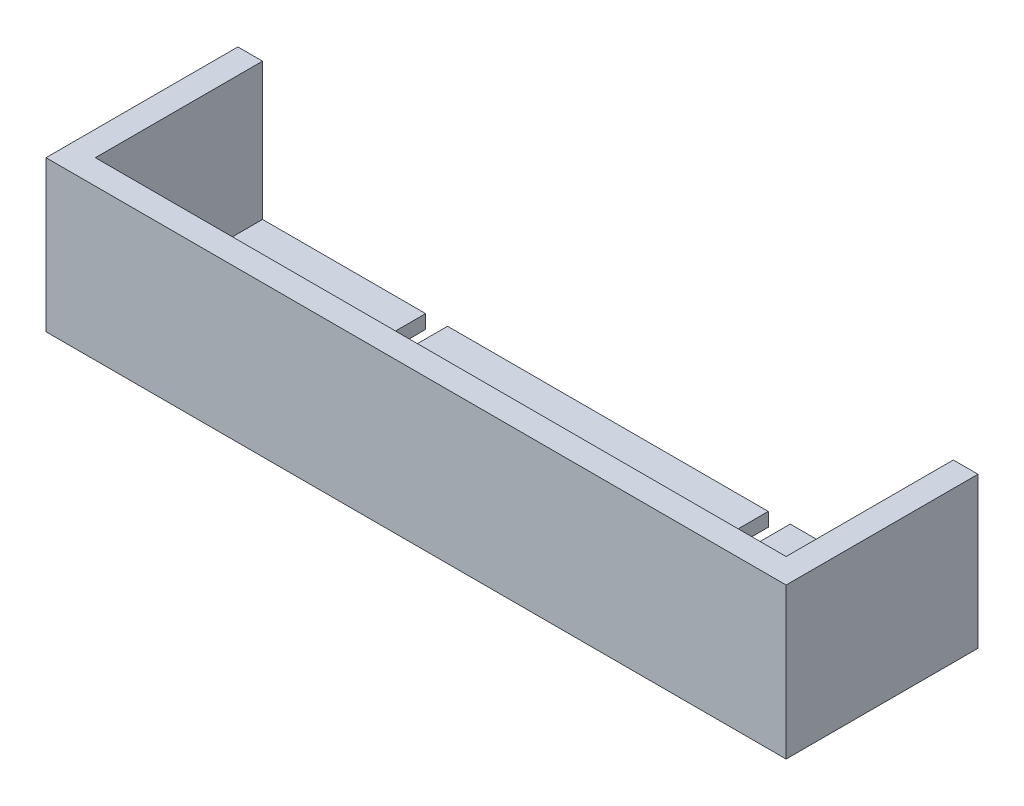
ISO-10303-21;
HEADER;
FILE_DESCRIPTION(('STEP AP214'),'2;1');
FILE_NAME('part.step','',(''),(''),'','','');
FILE_SCHEMA(('AUTOMOTIVE_DESIGN { 1 0 10303 214 1 1 1 1 }'));
ENDSEC;
DATA;
#1=APPLICATION_CONTEXT('core data for automotive mechanical design processes');
#2=APPLICATION_PROTOCOL_DEFINITION('international standard','automotive_design',2000,#1);
#3=PRODUCT_CONTEXT('',#1,'mechanical');
#4=PRODUCT('Part','Part','',(#3));
#5=PRODUCT_RELATED_PRODUCT_CATEGORY('part','',(#4));
#6=PRODUCT_DEFINITION_FORMATION('','',#4);
#7=PRODUCT_DEFINITION_CONTEXT('part definition',#1,'design');
#8=PRODUCT_DEFINITION('design','',#6,#7);
#9=PRODUCT_DEFINITION_SHAPE('','',#8);
#10=(LENGTH_UNIT() NAMED_UNIT(*) SI_UNIT(.MILLI.,.METRE.));
#11=(NAMED_UNIT(*) PLANE_ANGLE_UNIT() SI_UNIT($,.RADIAN.));
#12=(NAMED_UNIT(*) SI_UNIT($,.STERADIAN.) SOLID_ANGLE_UNIT());
#13=UNCERTAINTY_MEASURE_WITH_UNIT(LENGTH_MEASURE(1.E-05),#10,'distance_accuracy_value','');
#14=(GEOMETRIC_REPRESENTATION_CONTEXT(3) GLOBAL_UNCERTAINTY_ASSIGNED_CONTEXT((#13)) GLOBAL_UNIT_ASSIGNED_CONTEXT((#10,
#11,#12)) REPRESENTATION_CONTEXT('',''));
#15=CARTESIAN_POINT('',(0.,0.,0.));
#16=DIRECTION('',(0.,0.,1.));
#17=DIRECTION('',(1.,0.,0.));
#18=AXIS2_PLACEMENT_3D('',#15,#16,#17);
#19=CARTESIAN_POINT('',(-27.,10.,-7.));
#20=DIRECTION('',(0.,0.,1.));
#21=DIRECTION('',(1.,0.,0.));
#22=AXIS2_PLACEMENT_3D('',#19,#20,#21);
#23=PLANE('',#22);
#24=DIRECTION('',(-1.,0.,0.));
#25=VECTOR('',#24,1.);
#26=CARTESIAN_POINT('',(-27.,10.,-7.));
#27=LINE('',#26,#25);
#28=CARTESIAN_POINT('',(-25.2,10.,-7.));
#29=VERTEX_POINT('',#28);
#30=CARTESIAN_POINT('',(-27.,10.,-7.));
#31=VERTEX_POINT('',#30);
#32=EDGE_CURVE('E195',#29,#31,#27,.T.);
#33=ORIENTED_EDGE('',*,*,#32,.F.);
#34=DIRECTION('',(0.,1.,0.));
#35=VECTOR('',#34,1.);
#36=CARTESIAN_POINT('',(-25.2,0.,-7.));
#37=LINE('',#36,#35);
#38=CARTESIAN_POINT('',(-25.2,0.,-7.));
#39=VERTEX_POINT('',#38);
#40=EDGE_CURVE('E169',#39,#29,#37,.T.);
#41=ORIENTED_EDGE('',*,*,#40,.F.);
#42=DIRECTION('',(-1.,0.,0.));
#43=VECTOR('',#42,1.);
#44=CARTESIAN_POINT('',(-25.2,0.,-7.));
#45=LINE('',#44,#43);
#46=CARTESIAN_POINT('',(-13.3,0.,-7.));
#47=VERTEX_POINT('',#46);
#48=EDGE_CURVE('E176',#47,#39,#45,.T.);
#49=ORIENTED_EDGE('',*,*,#48,.F.);
#50=DIRECTION('',(0.,1.,0.));
#51=VECTOR('',#50,1.);
#52=CARTESIAN_POINT('',(-13.3,-1.,-7.));
#53=LINE('',#52,#51);
#54=CARTESIAN_POINT('',(-13.3,-1.,-7.));
#55=VERTEX_POINT('',#54);
#56=EDGE_CURVE('E255',#55,#47,#53,.T.);
#57=ORIENTED_EDGE('',*,*,#56,.F.);
#58=DIRECTION('',(1.,0.,0.));
#59=VECTOR('',#58,1.);
#60=CARTESIAN_POINT('',(-27.,-1.,-7.));
#61=LINE('',#60,#59);
#62=CARTESIAN_POINT('',(-27.,-1.,-7.));
#63=VERTEX_POINT('',#62);
#64=EDGE_CURVE('E229',#63,#55,#61,.T.);
#65=ORIENTED_EDGE('',*,*,#64,.F.);
#66=DIRECTION('',(0.,-1.,0.));
#67=VECTOR('',#66,1.);
#68=CARTESIAN_POINT('',(-27.,10.,-7.));
#69=LINE('',#68,#67);
#70=EDGE_CURVE('E197',#31,#63,#69,.T.);
#71=ORIENTED_EDGE('',*,*,#70,.F.);
#72=EDGE_LOOP('',(#33,#41,#49,#57,#65,#71));
#73=FACE_BOUND('',#72,.T.);
#74=ADVANCED_FACE('F33',(#73),#23,.F.);
#75=DIRECTION('',(0.,1.,0.));
#76=VECTOR('',#75,1.);
#77=CARTESIAN_POINT('',(-11.7,-1.,-7.));
#78=LINE('',#77,#76);
#79=CARTESIAN_POINT('',(-11.7,-1.,-7.));
#80=VERTEX_POINT('',#79);
#81=CARTESIAN_POINT('',(-11.7,0.,-7.));
#82=VERTEX_POINT('',#81);
#83=EDGE_CURVE('E56',#80,#82,#78,.T.);
#84=ORIENTED_EDGE('',*,*,#83,.T.);
#85=CARTESIAN_POINT('',(11.7,0.,-7.));
#86=VERTEX_POINT('',#85);
#87=EDGE_CURVE('E174',#86,#82,#45,.T.);
#88=ORIENTED_EDGE('',*,*,#87,.F.);
#89=DIRECTION('',(0.,1.,0.));
#90=VECTOR('',#89,1.);
#91=CARTESIAN_POINT('',(11.7,-1.,-7.));
#92=LINE('',#91,#90);
#93=CARTESIAN_POINT('',(11.7,-1.,-7.));
#94=VERTEX_POINT('',#93);
#95=EDGE_CURVE('E272',#94,#86,#92,.T.);
#96=ORIENTED_EDGE('',*,*,#95,.F.);
#97=EDGE_CURVE('E253',#80,#94,#61,.T.);
#98=ORIENTED_EDGE('',*,*,#97,.F.);
#99=EDGE_LOOP('',(#84,#88,#96,#98));
#100=FACE_BOUND('',#99,.T.);
#101=ADVANCED_FACE('F269',(#100),#23,.F.);
#102=CARTESIAN_POINT('',(0.,0.,0.));
#103=DIRECTION('',(0.,-1.,0.));
#104=DIRECTION('',(0.,0.,-1.));
#105=AXIS2_PLACEMENT_3D('',#102,#103,#104);
#106=PLANE('',#105);
#107=DIRECTION('',(0.,0.,-1.));
#108=VECTOR('',#107,1.);
#109=CARTESIAN_POINT('',(-11.7,0.,0.));
#110=LINE('',#109,#108);
#111=CARTESIAN_POINT('',(-11.7,0.,0.));
#112=VERTEX_POINT('',#111);
#113=EDGE_CURVE('E297',#112,#82,#110,.T.);
#114=ORIENTED_EDGE('',*,*,#113,.F.);
#115=CARTESIAN_POINT('',(-12.5,0.,0.));
#116=DIRECTION('',(0.,1.,0.));
#117=DIRECTION('',(0.,0.,1.));
#118=AXIS2_PLACEMENT_3D('',#115,#116,#117);
#119=CIRCLE('',#118,0.799999999999999);
#120=CARTESIAN_POINT('',(-13.3,0.,0.));
#121=VERTEX_POINT('',#120);
#122=EDGE_CURVE('E277',#121,#112,#119,.T.);
#123=ORIENTED_EDGE('',*,*,#122,.F.);
#124=DIRECTION('',(0.,0.,1.));
#125=VECTOR('',#124,1.);
#126=CARTESIAN_POINT('',(-13.3,0.,0.));
#127=LINE('',#126,#125);
#128=EDGE_CURVE('E294',#47,#121,#127,.T.);
#129=ORIENTED_EDGE('',*,*,#128,.F.);
#130=ORIENTED_EDGE('',*,*,#48,.T.);
#131=DIRECTION('',(0.,0.,1.));
#132=VECTOR('',#131,1.);
#133=CARTESIAN_POINT('',(-25.2,0.,-5.2));
#134=LINE('',#133,#132);
#135=CARTESIAN_POINT('',(-25.2,0.,5.2));
#136=VERTEX_POINT('',#135);
#137=EDGE_CURVE('E192',#39,#136,#134,.T.);
#138=ORIENTED_EDGE('',*,*,#137,.T.);
#139=DIRECTION('',(1.,0.,0.));
#140=VECTOR('',#139,1.);
#141=CARTESIAN_POINT('',(-25.2,0.,5.2));
#142=LINE('',#141,#140);
#143=CARTESIAN_POINT('',(25.2,0.,5.2));
#144=VERTEX_POINT('',#143);
#145=EDGE_CURVE('E156',#136,#144,#142,.T.);
#146=ORIENTED_EDGE('',*,*,#145,.T.);
#147=DIRECTION('',(0.,0.,-1.));
#148=VECTOR('',#147,1.);
#149=CARTESIAN_POINT('',(25.2,0.,-5.2));
#150=LINE('',#149,#148);
#151=CARTESIAN_POINT('',(25.2,0.,-7.));
#152=VERTEX_POINT('',#151);
#153=EDGE_CURVE('E148',#144,#152,#150,.T.);
#154=ORIENTED_EDGE('',*,*,#153,.T.);
#155=CARTESIAN_POINT('',(13.3,0.,-7.));
#156=VERTEX_POINT('',#155);
#157=EDGE_CURVE('E154',#152,#156,#45,.T.);
#158=ORIENTED_EDGE('',*,*,#157,.T.);
#159=DIRECTION('',(0.,0.,-1.));
#160=VECTOR('',#159,1.);
#161=CARTESIAN_POINT('',(13.3,0.,0.));
#162=LINE('',#161,#160);
#163=CARTESIAN_POINT('',(13.3,0.,0.));
#164=VERTEX_POINT('',#163);
#165=EDGE_CURVE('E178',#164,#156,#162,.T.);
#166=ORIENTED_EDGE('',*,*,#165,.F.);
#167=CARTESIAN_POINT('',(12.5,0.,0.));
#168=DIRECTION('',(0.,1.,0.));
#169=DIRECTION('',(0.,0.,1.));
#170=AXIS2_PLACEMENT_3D('',#167,#168,#169);
#171=CIRCLE('',#170,0.8);
#172=CARTESIAN_POINT('',(11.7,0.,0.));
#173=VERTEX_POINT('',#172);
#174=EDGE_CURVE('E173',#173,#164,#171,.T.);
#175=ORIENTED_EDGE('',*,*,#174,.F.);
#176=DIRECTION('',(0.,0.,1.));
#177=VECTOR('',#176,1.);
#178=CARTESIAN_POINT('',(11.7,0.,0.));
#179=LINE('',#178,#177);
#180=EDGE_CURVE('E280',#86,#173,#179,.T.);
#181=ORIENTED_EDGE('',*,*,#180,.F.);
#182=ORIENTED_EDGE('',*,*,#87,.T.);
#183=EDGE_LOOP('',(#114,#123,#129,#130,#138,#146,#154,#158,#166,#175,#181,#182));
#184=FACE_BOUND('',#183,.T.);
#185=ADVANCED_FACE('F151',(#184),#106,.F.);
#186=CARTESIAN_POINT('',(0.,10.,0.));
#187=DIRECTION('',(0.,1.,0.));
#188=DIRECTION('',(0.,0.,1.));
#189=AXIS2_PLACEMENT_3D('',#186,#187,#188);
#190=PLANE('',#189);
#191=DIRECTION('',(0.,0.,1.));
#192=VECTOR('',#191,1.);
#193=CARTESIAN_POINT('',(-25.2,10.,-5.2));
#194=LINE('',#193,#192);
#195=CARTESIAN_POINT('',(-25.2,10.,5.2));
#196=VERTEX_POINT('',#195);
#197=EDGE_CURVE('E159',#29,#196,#194,.T.);
#198=ORIENTED_EDGE('',*,*,#197,.F.);
#199=ORIENTED_EDGE('',*,*,#32,.T.);
#200=DIRECTION('',(0.,0.,1.));
#201=VECTOR('',#200,1.);
#202=CARTESIAN_POINT('',(-27.,10.,-7.));
#203=LINE('',#202,#201);
#204=CARTESIAN_POINT('',(-27.,10.,7.));
#205=VERTEX_POINT('',#204);
#206=EDGE_CURVE('E246',#31,#205,#203,.T.);
#207=ORIENTED_EDGE('',*,*,#206,.T.);
#208=DIRECTION('',(1.,0.,0.));
#209=VECTOR('',#208,1.);
#210=CARTESIAN_POINT('',(-27.,10.,7.));
#211=LINE('',#210,#209);
#212=CARTESIAN_POINT('',(27.,10.,7.));
#213=VERTEX_POINT('',#212);
#214=EDGE_CURVE('E204',#205,#213,#211,.T.);
#215=ORIENTED_EDGE('',*,*,#214,.T.);
#216=DIRECTION('',(0.,0.,-1.));
#217=VECTOR('',#216,1.);
#218=CARTESIAN_POINT('',(27.,10.,-7.));
#219=LINE('',#218,#217);
#220=CARTESIAN_POINT('',(27.,10.,-7.));
#221=VERTEX_POINT('',#220);
#222=EDGE_CURVE('E202',#213,#221,#219,.T.);
#223=ORIENTED_EDGE('',*,*,#222,.T.);
#224=CARTESIAN_POINT('',(25.2,10.,-7.));
#225=VERTEX_POINT('',#224);
#226=EDGE_CURVE('E201',#221,#225,#27,.T.);
#227=ORIENTED_EDGE('',*,*,#226,.T.);
#228=DIRECTION('',(0.,0.,-1.));
#229=VECTOR('',#228,1.);
#230=CARTESIAN_POINT('',(25.2,10.,-5.2));
#231=LINE('',#230,#229);
#232=CARTESIAN_POINT('',(25.2,10.,5.2));
#233=VERTEX_POINT('',#232);
#234=EDGE_CURVE('E165',#233,#225,#231,.T.);
#235=ORIENTED_EDGE('',*,*,#234,.F.);
#236=DIRECTION('',(1.,0.,0.));
#237=VECTOR('',#236,1.);
#238=CARTESIAN_POINT('',(-25.2,10.,5.2));
#239=LINE('',#238,#237);
#240=EDGE_CURVE('E238',#196,#233,#239,.T.);
#241=ORIENTED_EDGE('',*,*,#240,.F.);
#242=EDGE_LOOP('',(#198,#199,#207,#215,#223,#227,#235,#241));
#243=FACE_BOUND('',#242,.T.);
#244=ADVANCED_FACE('F247',(#243),#190,.T.);
#245=CARTESIAN_POINT('',(-27.,10.,-7.));
#246=DIRECTION('',(1.,0.,0.));
#247=DIRECTION('',(0.,0.,-1.));
#248=AXIS2_PLACEMENT_3D('',#245,#246,#247);
#249=PLANE('',#248);
#250=ORIENTED_EDGE('',*,*,#70,.T.);
#251=DIRECTION('',(0.,0.,-1.));
#252=VECTOR('',#251,1.);
#253=CARTESIAN_POINT('',(-27.,-1.,7.));
#254=LINE('',#253,#252);
#255=CARTESIAN_POINT('',(-27.,-1.,7.));
#256=VERTEX_POINT('',#255);
#257=EDGE_CURVE('E249',#256,#63,#254,.T.);
#258=ORIENTED_EDGE('',*,*,#257,.F.);
#259=DIRECTION('',(0.,-1.,0.));
#260=VECTOR('',#259,1.);
#261=CARTESIAN_POINT('',(-27.,10.,7.));
#262=LINE('',#261,#260);
#263=EDGE_CURVE('E11',#205,#256,#262,.T.);
#264=ORIENTED_EDGE('',*,*,#263,.F.);
#265=ORIENTED_EDGE('',*,*,#206,.F.);
#266=EDGE_LOOP('',(#250,#258,#264,#265));
#267=FACE_BOUND('',#266,.T.);
#268=ADVANCED_FACE('F35',(#267),#249,.F.);
#269=CARTESIAN_POINT('',(-27.,10.,7.));
#270=DIRECTION('',(0.,0.,-1.));
#271=DIRECTION('',(-1.,0.,0.));
#272=AXIS2_PLACEMENT_3D('',#269,#270,#271);
#273=PLANE('',#272);
#274=ORIENTED_EDGE('',*,*,#263,.T.);
#275=DIRECTION('',(-1.,0.,0.));
#276=VECTOR('',#275,1.);
#277=CARTESIAN_POINT('',(-27.,-1.,7.));
#278=LINE('',#277,#276);
#279=CARTESIAN_POINT('',(27.,-1.,7.));
#280=VERTEX_POINT('',#279);
#281=EDGE_CURVE('E226',#280,#256,#278,.T.);
#282=ORIENTED_EDGE('',*,*,#281,.F.);
#283=DIRECTION('',(0.,-1.,0.));
#284=VECTOR('',#283,1.);
#285=CARTESIAN_POINT('',(27.,10.,7.));
#286=LINE('',#285,#284);
#287=EDGE_CURVE('E41',#213,#280,#286,.T.);
#288=ORIENTED_EDGE('',*,*,#287,.F.);
#289=ORIENTED_EDGE('',*,*,#214,.F.);
#290=EDGE_LOOP('',(#274,#282,#288,#289));
#291=FACE_BOUND('',#290,.T.);
#292=ADVANCED_FACE('F231',(#291),#273,.F.);
#293=CARTESIAN_POINT('',(27.,10.,-7.));
#294=DIRECTION('',(-1.,0.,0.));
#295=DIRECTION('',(0.,0.,1.));
#296=AXIS2_PLACEMENT_3D('',#293,#294,#295);
#297=PLANE('',#296);
#298=ORIENTED_EDGE('',*,*,#287,.T.);
#299=DIRECTION('',(0.,0.,1.));
#300=VECTOR('',#299,1.);
#301=CARTESIAN_POINT('',(27.,-1.,7.));
#302=LINE('',#301,#300);
#303=CARTESIAN_POINT('',(27.,-1.,-7.));
#304=VERTEX_POINT('',#303);
#305=EDGE_CURVE('E218',#304,#280,#302,.T.);
#306=ORIENTED_EDGE('',*,*,#305,.F.);
#307=DIRECTION('',(0.,-1.,0.));
#308=VECTOR('',#307,1.);
#309=CARTESIAN_POINT('',(27.,10.,-7.));
#310=LINE('',#309,#308);
#311=EDGE_CURVE('E209',#221,#304,#310,.T.);
#312=ORIENTED_EDGE('',*,*,#311,.F.);
#313=ORIENTED_EDGE('',*,*,#222,.F.);
#314=EDGE_LOOP('',(#298,#306,#312,#313));
#315=FACE_BOUND('',#314,.T.);
#316=ADVANCED_FACE('F216',(#315),#297,.F.);
#317=ORIENTED_EDGE('',*,*,#157,.F.);
#318=DIRECTION('',(0.,-1.,0.));
#319=VECTOR('',#318,1.);
#320=CARTESIAN_POINT('',(25.2,0.,-7.));
#321=LINE('',#320,#319);
#322=EDGE_CURVE('E162',#225,#152,#321,.T.);
#323=ORIENTED_EDGE('',*,*,#322,.F.);
#324=ORIENTED_EDGE('',*,*,#226,.F.);
#325=ORIENTED_EDGE('',*,*,#311,.T.);
#326=CARTESIAN_POINT('',(13.3,-1.,-7.));
#327=VERTEX_POINT('',#326);
#328=EDGE_CURVE('E228',#327,#304,#61,.T.);
#329=ORIENTED_EDGE('',*,*,#328,.F.);
#330=DIRECTION('',(0.,1.,0.));
#331=VECTOR('',#330,1.);
#332=CARTESIAN_POINT('',(13.3,-1.,-7.));
#333=LINE('',#332,#331);
#334=EDGE_CURVE('E48',#327,#156,#333,.T.);
#335=ORIENTED_EDGE('',*,*,#334,.T.);
#336=EDGE_LOOP('',(#317,#323,#324,#325,#329,#335));
#337=FACE_BOUND('',#336,.T.);
#338=ADVANCED_FACE('F171',(#337),#23,.F.);
#339=CARTESIAN_POINT('',(-25.2,10.,-5.2));
#340=DIRECTION('',(1.,0.,0.));
#341=DIRECTION('',(0.,0.,-1.));
#342=AXIS2_PLACEMENT_3D('',#339,#340,#341);
#343=PLANE('',#342);
#344=ORIENTED_EDGE('',*,*,#137,.F.);
#345=ORIENTED_EDGE('',*,*,#40,.T.);
#346=ORIENTED_EDGE('',*,*,#197,.T.);
#347=DIRECTION('',(0.,-1.,0.));
#348=VECTOR('',#347,1.);
#349=CARTESIAN_POINT('',(-25.2,10.,5.2));
#350=LINE('',#349,#348);
#351=EDGE_CURVE('E244',#196,#136,#350,.T.);
#352=ORIENTED_EDGE('',*,*,#351,.T.);
#353=EDGE_LOOP('',(#344,#345,#346,#352));
#354=FACE_BOUND('',#353,.T.);
#355=ADVANCED_FACE('F189',(#354),#343,.T.);
#356=CARTESIAN_POINT('',(-25.2,10.,5.2));
#357=DIRECTION('',(0.,0.,-1.));
#358=DIRECTION('',(-1.,0.,0.));
#359=AXIS2_PLACEMENT_3D('',#356,#357,#358);
#360=PLANE('',#359);
#361=ORIENTED_EDGE('',*,*,#145,.F.);
#362=ORIENTED_EDGE('',*,*,#351,.F.);
#363=ORIENTED_EDGE('',*,*,#240,.T.);
#364=DIRECTION('',(0.,-1.,0.));
#365=VECTOR('',#364,1.);
#366=CARTESIAN_POINT('',(25.2,10.,5.2));
#367=LINE('',#366,#365);
#368=EDGE_CURVE('E240',#233,#144,#367,.T.);
#369=ORIENTED_EDGE('',*,*,#368,.T.);
#370=EDGE_LOOP('',(#361,#362,#363,#369));
#371=FACE_BOUND('',#370,.T.);
#372=ADVANCED_FACE('F328',(#371),#360,.T.);
#373=CARTESIAN_POINT('',(25.2,10.,-5.2));
#374=DIRECTION('',(-1.,0.,0.));
#375=DIRECTION('',(0.,0.,1.));
#376=AXIS2_PLACEMENT_3D('',#373,#374,#375);
#377=PLANE('',#376);
#378=ORIENTED_EDGE('',*,*,#153,.F.);
#379=ORIENTED_EDGE('',*,*,#368,.F.);
#380=ORIENTED_EDGE('',*,*,#234,.T.);
#381=ORIENTED_EDGE('',*,*,#322,.T.);
#382=EDGE_LOOP('',(#378,#379,#380,#381));
#383=FACE_BOUND('',#382,.T.);
#384=ADVANCED_FACE('F163',(#383),#377,.T.);
#385=CARTESIAN_POINT('',(0.,-1.,0.));
#386=DIRECTION('',(0.,-1.,0.));
#387=DIRECTION('',(0.,0.,-1.));
#388=AXIS2_PLACEMENT_3D('',#385,#386,#387);
#389=PLANE('',#388);
#390=DIRECTION('',(0.,0.,1.));
#391=VECTOR('',#390,1.);
#392=CARTESIAN_POINT('',(-13.3,-1.,0.));
#393=LINE('',#392,#391);
#394=CARTESIAN_POINT('',(-13.3,-1.,0.));
#395=VERTEX_POINT('',#394);
#396=EDGE_CURVE('E290',#55,#395,#393,.T.);
#397=ORIENTED_EDGE('',*,*,#396,.T.);
#398=CARTESIAN_POINT('',(-12.5,-1.,0.));
#399=DIRECTION('',(0.,1.,0.));
#400=DIRECTION('',(0.,0.,1.));
#401=AXIS2_PLACEMENT_3D('',#398,#399,#400);
#402=CIRCLE('',#401,0.799999999999999);
#403=CARTESIAN_POINT('',(-11.7,-1.,0.));
#404=VERTEX_POINT('',#403);
#405=EDGE_CURVE('E296',#395,#404,#402,.T.);
#406=ORIENTED_EDGE('',*,*,#405,.T.);
#407=DIRECTION('',(0.,0.,-1.));
#408=VECTOR('',#407,1.);
#409=CARTESIAN_POINT('',(-11.7,-1.,0.));
#410=LINE('',#409,#408);
#411=EDGE_CURVE('E266',#404,#80,#410,.T.);
#412=ORIENTED_EDGE('',*,*,#411,.T.);
#413=ORIENTED_EDGE('',*,*,#97,.T.);
#414=DIRECTION('',(0.,0.,1.));
#415=VECTOR('',#414,1.);
#416=CARTESIAN_POINT('',(11.7,-1.,0.));
#417=LINE('',#416,#415);
#418=CARTESIAN_POINT('',(11.7,-1.,0.));
#419=VERTEX_POINT('',#418);
#420=EDGE_CURVE('E264',#94,#419,#417,.T.);
#421=ORIENTED_EDGE('',*,*,#420,.T.);
#422=CARTESIAN_POINT('',(12.5,-1.,0.));
#423=DIRECTION('',(0.,1.,0.));
#424=DIRECTION('',(0.,0.,1.));
#425=AXIS2_PLACEMENT_3D('',#422,#423,#424);
#426=CIRCLE('',#425,0.8);
#427=CARTESIAN_POINT('',(13.3,-1.,0.));
#428=VERTEX_POINT('',#427);
#429=EDGE_CURVE('E282',#419,#428,#426,.T.);
#430=ORIENTED_EDGE('',*,*,#429,.T.);
#431=DIRECTION('',(0.,0.,-1.));
#432=VECTOR('',#431,1.);
#433=CARTESIAN_POINT('',(13.3,-1.,0.));
#434=LINE('',#433,#432);
#435=EDGE_CURVE('E285',#428,#327,#434,.T.);
#436=ORIENTED_EDGE('',*,*,#435,.T.);
#437=ORIENTED_EDGE('',*,*,#328,.T.);
#438=ORIENTED_EDGE('',*,*,#305,.T.);
#439=ORIENTED_EDGE('',*,*,#281,.T.);
#440=ORIENTED_EDGE('',*,*,#257,.T.);
#441=ORIENTED_EDGE('',*,*,#64,.T.);
#442=EDGE_LOOP('',(#397,#406,#412,#413,#421,#430,#436,#437,#438,#439,#440,#441));
#443=FACE_BOUND('',#442,.T.);
#444=ADVANCED_FACE('F224',(#443),#389,.T.);
#445=CARTESIAN_POINT('',(12.5,-1.,0.));
#446=DIRECTION('',(0.,1.,0.));
#447=DIRECTION('',(0.,0.,1.));
#448=AXIS2_PLACEMENT_3D('',#445,#446,#447);
#449=CYLINDRICAL_SURFACE('',#448,0.8);
#450=ORIENTED_EDGE('',*,*,#174,.T.);
#451=DIRECTION('',(0.,1.,0.));
#452=VECTOR('',#451,1.);
#453=CARTESIAN_POINT('',(13.3,-1.,0.));
#454=LINE('',#453,#452);
#455=EDGE_CURVE('E258',#428,#164,#454,.T.);
#456=ORIENTED_EDGE('',*,*,#455,.F.);
#457=ORIENTED_EDGE('',*,*,#429,.F.);
#458=DIRECTION('',(0.,1.,0.));
#459=VECTOR('',#458,1.);
#460=CARTESIAN_POINT('',(11.7,-1.,0.));
#461=LINE('',#460,#459);
#462=EDGE_CURVE('E274',#419,#173,#461,.T.);
#463=ORIENTED_EDGE('',*,*,#462,.T.);
#464=EDGE_LOOP('',(#450,#456,#457,#463));
#465=FACE_BOUND('',#464,.T.);
#466=ADVANCED_FACE('F351',(#465),#449,.F.);
#467=CARTESIAN_POINT('',(11.7,-1.,0.));
#468=DIRECTION('',(-1.,0.,0.));
#469=DIRECTION('',(0.,0.,1.));
#470=AXIS2_PLACEMENT_3D('',#467,#468,#469);
#471=PLANE('',#470);
#472=ORIENTED_EDGE('',*,*,#95,.T.);
#473=ORIENTED_EDGE('',*,*,#180,.T.);
#474=ORIENTED_EDGE('',*,*,#462,.F.);
#475=ORIENTED_EDGE('',*,*,#420,.F.);
#476=EDGE_LOOP('',(#472,#473,#474,#475));
#477=FACE_BOUND('',#476,.T.);
#478=ADVANCED_FACE('F354',(#477),#471,.F.);
#479=CARTESIAN_POINT('',(13.3,-1.,0.));
#480=DIRECTION('',(1.,0.,0.));
#481=DIRECTION('',(0.,0.,-1.));
#482=AXIS2_PLACEMENT_3D('',#479,#480,#481);
#483=PLANE('',#482);
#484=ORIENTED_EDGE('',*,*,#165,.T.);
#485=ORIENTED_EDGE('',*,*,#334,.F.);
#486=ORIENTED_EDGE('',*,*,#435,.F.);
#487=ORIENTED_EDGE('',*,*,#455,.T.);
#488=EDGE_LOOP('',(#484,#485,#486,#487));
#489=FACE_BOUND('',#488,.T.);
#490=ADVANCED_FACE('F356',(#489),#483,.F.);
#491=CARTESIAN_POINT('',(-12.5,-1.,0.));
#492=DIRECTION('',(0.,1.,0.));
#493=DIRECTION('',(0.,0.,1.));
#494=AXIS2_PLACEMENT_3D('',#491,#492,#493);
#495=CYLINDRICAL_SURFACE('',#494,0.799999999999999);
#496=ORIENTED_EDGE('',*,*,#122,.T.);
#497=DIRECTION('',(0.,1.,0.));
#498=VECTOR('',#497,1.);
#499=CARTESIAN_POINT('',(-11.7,-1.,0.));
#500=LINE('',#499,#498);
#501=EDGE_CURVE('E288',#404,#112,#500,.T.);
#502=ORIENTED_EDGE('',*,*,#501,.F.);
#503=ORIENTED_EDGE('',*,*,#405,.F.);
#504=DIRECTION('',(0.,1.,0.));
#505=VECTOR('',#504,1.);
#506=CARTESIAN_POINT('',(-13.3,-1.,0.));
#507=LINE('',#506,#505);
#508=EDGE_CURVE('E251',#395,#121,#507,.T.);
#509=ORIENTED_EDGE('',*,*,#508,.T.);
#510=EDGE_LOOP('',(#496,#502,#503,#509));
#511=FACE_BOUND('',#510,.T.);
#512=ADVANCED_FACE('F304',(#511),#495,.F.);
#513=CARTESIAN_POINT('',(-13.3,-1.,0.));
#514=DIRECTION('',(-1.,0.,0.));
#515=DIRECTION('',(0.,0.,1.));
#516=AXIS2_PLACEMENT_3D('',#513,#514,#515);
#517=PLANE('',#516);
#518=ORIENTED_EDGE('',*,*,#56,.T.);
#519=ORIENTED_EDGE('',*,*,#128,.T.);
#520=ORIENTED_EDGE('',*,*,#508,.F.);
#521=ORIENTED_EDGE('',*,*,#396,.F.);
#522=EDGE_LOOP('',(#518,#519,#520,#521));
#523=FACE_BOUND('',#522,.T.);
#524=ADVANCED_FACE('F308',(#523),#517,.F.);
#525=CARTESIAN_POINT('',(-11.7,-1.,0.));
#526=DIRECTION('',(1.,0.,0.));
#527=DIRECTION('',(0.,0.,-1.));
#528=AXIS2_PLACEMENT_3D('',#525,#526,#527);
#529=PLANE('',#528);
#530=ORIENTED_EDGE('',*,*,#113,.T.);
#531=ORIENTED_EDGE('',*,*,#83,.F.);
#532=ORIENTED_EDGE('',*,*,#411,.F.);
#533=ORIENTED_EDGE('',*,*,#501,.T.);
#534=EDGE_LOOP('',(#530,#531,#532,#533));
#535=FACE_BOUND('',#534,.T.);
#536=ADVANCED_FACE('F306',(#535),#529,.F.);
#537=CLOSED_SHELL('',(#74,#101,#185,#244,#268,#292,#316,#338,#355,#372,#384,#444,#466,#478,#490,
#512,#524,#536));
#538=MANIFOLD_SOLID_BREP('B2',#537);
#539=ADVANCED_BREP_SHAPE_REPRESENTATION('',(#18,#538),#14);
#540=SHAPE_DEFINITION_REPRESENTATION(#9,#539);
ENDSEC;
END-ISO-10303-21;
